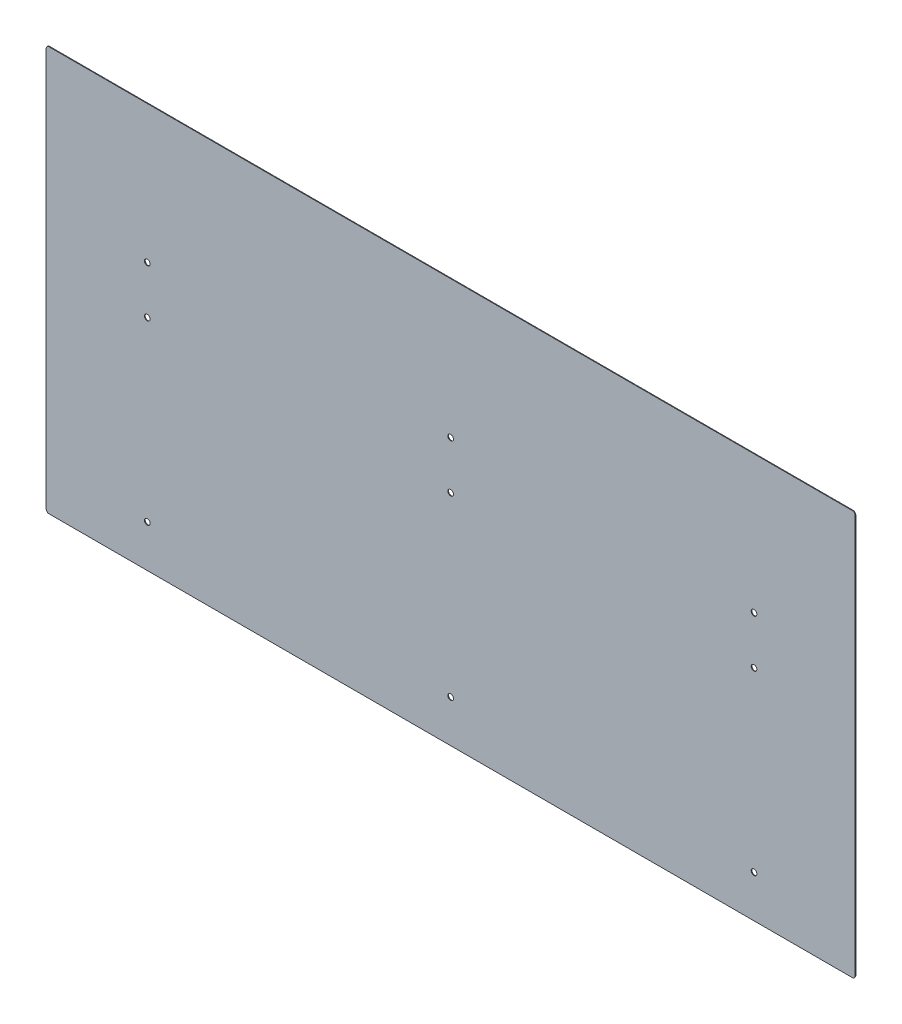
ISO-10303-21;
HEADER;
FILE_DESCRIPTION(('STEP AP214'),'2;1');
FILE_NAME('part.step','',(''),(''),'','','');
FILE_SCHEMA(('AUTOMOTIVE_DESIGN { 1 0 10303 214 1 1 1 1 }'));
ENDSEC;
DATA;
#1=APPLICATION_CONTEXT('core data for automotive mechanical design processes');
#2=APPLICATION_PROTOCOL_DEFINITION('international standard','automotive_design',2000,#1);
#3=PRODUCT_CONTEXT('',#1,'mechanical');
#4=PRODUCT('Part','Part','',(#3));
#5=PRODUCT_RELATED_PRODUCT_CATEGORY('part','',(#4));
#6=PRODUCT_DEFINITION_FORMATION('','',#4);
#7=PRODUCT_DEFINITION_CONTEXT('part definition',#1,'design');
#8=PRODUCT_DEFINITION('design','',#6,#7);
#9=PRODUCT_DEFINITION_SHAPE('','',#8);
#10=(LENGTH_UNIT() NAMED_UNIT(*) SI_UNIT(.MILLI.,.METRE.));
#11=(NAMED_UNIT(*) PLANE_ANGLE_UNIT() SI_UNIT($,.RADIAN.));
#12=(NAMED_UNIT(*) SI_UNIT($,.STERADIAN.) SOLID_ANGLE_UNIT());
#13=UNCERTAINTY_MEASURE_WITH_UNIT(LENGTH_MEASURE(1.E-05),#10,'distance_accuracy_value','');
#14=(GEOMETRIC_REPRESENTATION_CONTEXT(3) GLOBAL_UNCERTAINTY_ASSIGNED_CONTEXT((#13)) GLOBAL_UNIT_ASSIGNED_CONTEXT((#10,
#11,#12)) REPRESENTATION_CONTEXT('',''));
#15=CARTESIAN_POINT('',(0.,0.,0.));
#16=DIRECTION('',(0.,0.,1.));
#17=DIRECTION('',(1.,0.,0.));
#18=AXIS2_PLACEMENT_3D('',#15,#16,#17);
#19=CARTESIAN_POINT('',(0.,0.,3.175));
#20=DIRECTION('',(1.,0.,0.));
#21=DIRECTION('',(0.,0.,-1.));
#22=AXIS2_PLACEMENT_3D('',#19,#20,#21);
#23=PLANE('',#22);
#24=DIRECTION('',(0.,0.,-1.));
#25=VECTOR('',#24,1.);
#26=CARTESIAN_POINT('',(0.,3.175,3.175));
#27=LINE('',#26,#25);
#28=CARTESIAN_POINT('',(0.,3.175,0.));
#29=VERTEX_POINT('',#28);
#30=CARTESIAN_POINT('',(0.,3.17499999999998,0.761999999999945));
#31=VERTEX_POINT('',#30);
#32=EDGE_CURVE('E48',#29,#31,#27,.F.);
#33=ORIENTED_EDGE('',*,*,#32,.T.);
#34=DIRECTION('',(0.,1.,0.));
#35=VECTOR('',#34,1.);
#36=CARTESIAN_POINT('',(0.,457.2,0.762));
#37=LINE('',#36,#35);
#38=CARTESIAN_POINT('',(0.,454.025,0.762));
#39=VERTEX_POINT('',#38);
#40=EDGE_CURVE('E104',#31,#39,#37,.T.);
#41=ORIENTED_EDGE('',*,*,#40,.T.);
#42=DIRECTION('',(0.,0.,-1.));
#43=VECTOR('',#42,1.);
#44=CARTESIAN_POINT('',(0.,454.025,3.175));
#45=LINE('',#44,#43);
#46=CARTESIAN_POINT('',(0.,454.025,0.));
#47=VERTEX_POINT('',#46);
#48=EDGE_CURVE('E130',#39,#47,#45,.T.);
#49=ORIENTED_EDGE('',*,*,#48,.T.);
#50=DIRECTION('',(0.,-1.,0.));
#51=VECTOR('',#50,1.);
#52=CARTESIAN_POINT('',(0.,0.,0.));
#53=LINE('',#52,#51);
#54=EDGE_CURVE('E128',#47,#29,#53,.T.);
#55=ORIENTED_EDGE('',*,*,#54,.T.);
#56=EDGE_LOOP('',(#33,#41,#49,#55));
#57=FACE_BOUND('',#56,.T.);
#58=ADVANCED_FACE('F39',(#57),#23,.F.);
#59=CARTESIAN_POINT('',(0.,0.,3.175));
#60=DIRECTION('',(0.,1.,0.));
#61=DIRECTION('',(0.,0.,1.));
#62=AXIS2_PLACEMENT_3D('',#59,#60,#61);
#63=PLANE('',#62);
#64=DIRECTION('',(0.,0.,-1.));
#65=VECTOR('',#64,1.);
#66=CARTESIAN_POINT('',(911.225,0.,3.175));
#67=LINE('',#66,#65);
#68=CARTESIAN_POINT('',(911.225,0.,0.));
#69=VERTEX_POINT('',#68);
#70=CARTESIAN_POINT('',(911.225,0.,0.761999999999945));
#71=VERTEX_POINT('',#70);
#72=EDGE_CURVE('E134',#69,#71,#67,.F.);
#73=ORIENTED_EDGE('',*,*,#72,.T.);
#74=DIRECTION('',(1.,0.,0.));
#75=VECTOR('',#74,1.);
#76=CARTESIAN_POINT('',(0.,0.,0.761999999999945));
#77=LINE('',#76,#75);
#78=CARTESIAN_POINT('',(3.175,0.,0.761999999999945));
#79=VERTEX_POINT('',#78);
#80=EDGE_CURVE('E124',#79,#71,#77,.T.);
#81=ORIENTED_EDGE('',*,*,#80,.F.);
#82=DIRECTION('',(0.,0.,-1.));
#83=VECTOR('',#82,1.);
#84=CARTESIAN_POINT('',(3.175,0.,3.175));
#85=LINE('',#84,#83);
#86=CARTESIAN_POINT('',(3.175,0.,0.));
#87=VERTEX_POINT('',#86);
#88=EDGE_CURVE('E121',#79,#87,#85,.T.);
#89=ORIENTED_EDGE('',*,*,#88,.T.);
#90=DIRECTION('',(1.,0.,0.));
#91=VECTOR('',#90,1.);
#92=CARTESIAN_POINT('',(0.,0.,0.));
#93=LINE('',#92,#91);
#94=EDGE_CURVE('E174',#87,#69,#93,.T.);
#95=ORIENTED_EDGE('',*,*,#94,.T.);
#96=EDGE_LOOP('',(#73,#81,#89,#95));
#97=FACE_BOUND('',#96,.T.);
#98=ADVANCED_FACE('F282',(#97),#63,.F.);
#99=CARTESIAN_POINT('',(914.4,0.,3.175));
#100=DIRECTION('',(-1.,0.,0.));
#101=DIRECTION('',(0.,0.,1.));
#102=AXIS2_PLACEMENT_3D('',#99,#100,#101);
#103=PLANE('',#102);
#104=DIRECTION('',(0.,0.,-1.));
#105=VECTOR('',#104,1.);
#106=CARTESIAN_POINT('',(914.4,454.025,3.175));
#107=LINE('',#106,#105);
#108=CARTESIAN_POINT('',(914.4,454.025,0.));
#109=VERTEX_POINT('',#108);
#110=CARTESIAN_POINT('',(914.4,454.025,0.762));
#111=VERTEX_POINT('',#110);
#112=EDGE_CURVE('E142',#109,#111,#107,.F.);
#113=ORIENTED_EDGE('',*,*,#112,.T.);
#114=DIRECTION('',(0.,1.,0.));
#115=VECTOR('',#114,1.);
#116=CARTESIAN_POINT('',(914.4,457.2,0.762));
#117=LINE('',#116,#115);
#118=CARTESIAN_POINT('',(914.4,3.17499999999998,0.761999999999945));
#119=VERTEX_POINT('',#118);
#120=EDGE_CURVE('E114',#119,#111,#117,.T.);
#121=ORIENTED_EDGE('',*,*,#120,.F.);
#122=DIRECTION('',(0.,0.,-1.));
#123=VECTOR('',#122,1.);
#124=CARTESIAN_POINT('',(914.4,3.175,3.175));
#125=LINE('',#124,#123);
#126=CARTESIAN_POINT('',(914.4,3.175,0.));
#127=VERTEX_POINT('',#126);
#128=EDGE_CURVE('E146',#119,#127,#125,.T.);
#129=ORIENTED_EDGE('',*,*,#128,.T.);
#130=DIRECTION('',(0.,1.,0.));
#131=VECTOR('',#130,1.);
#132=CARTESIAN_POINT('',(914.4,0.,0.));
#133=LINE('',#132,#131);
#134=EDGE_CURVE('E170',#127,#109,#133,.T.);
#135=ORIENTED_EDGE('',*,*,#134,.T.);
#136=EDGE_LOOP('',(#113,#121,#129,#135));
#137=FACE_BOUND('',#136,.T.);
#138=ADVANCED_FACE('F272',(#137),#103,.F.);
#139=CARTESIAN_POINT('',(0.,457.2,3.175));
#140=DIRECTION('',(0.,-1.,0.));
#141=DIRECTION('',(0.,0.,-1.));
#142=AXIS2_PLACEMENT_3D('',#139,#140,#141);
#143=PLANE('',#142);
#144=DIRECTION('',(0.,0.,-1.));
#145=VECTOR('',#144,1.);
#146=CARTESIAN_POINT('',(3.175,457.2,3.175));
#147=LINE('',#146,#145);
#148=CARTESIAN_POINT('',(3.175,457.2,0.));
#149=VERTEX_POINT('',#148);
#150=CARTESIAN_POINT('',(3.175,457.2,0.762));
#151=VERTEX_POINT('',#150);
#152=EDGE_CURVE('E162',#149,#151,#147,.F.);
#153=ORIENTED_EDGE('',*,*,#152,.T.);
#154=DIRECTION('',(1.,0.,0.));
#155=VECTOR('',#154,1.);
#156=CARTESIAN_POINT('',(0.,457.2,0.762));
#157=LINE('',#156,#155);
#158=CARTESIAN_POINT('',(911.225,457.2,0.762));
#159=VERTEX_POINT('',#158);
#160=EDGE_CURVE('E54',#151,#159,#157,.T.);
#161=ORIENTED_EDGE('',*,*,#160,.T.);
#162=DIRECTION('',(0.,0.,-1.));
#163=VECTOR('',#162,1.);
#164=CARTESIAN_POINT('',(911.225,457.2,3.175));
#165=LINE('',#164,#163);
#166=CARTESIAN_POINT('',(911.225,457.2,0.));
#167=VERTEX_POINT('',#166);
#168=EDGE_CURVE('E159',#159,#167,#165,.T.);
#169=ORIENTED_EDGE('',*,*,#168,.T.);
#170=DIRECTION('',(-1.,0.,0.));
#171=VECTOR('',#170,1.);
#172=CARTESIAN_POINT('',(0.,457.2,0.));
#173=LINE('',#172,#171);
#174=EDGE_CURVE('E166',#167,#149,#173,.T.);
#175=ORIENTED_EDGE('',*,*,#174,.T.);
#176=EDGE_LOOP('',(#153,#161,#169,#175));
#177=FACE_BOUND('',#176,.T.);
#178=ADVANCED_FACE('F278',(#177),#143,.F.);
#179=CARTESIAN_POINT('',(0.,0.,0.));
#180=DIRECTION('',(0.,0.,-1.));
#181=DIRECTION('',(-1.,0.,0.));
#182=AXIS2_PLACEMENT_3D('',#179,#180,#181);
#183=PLANE('',#182);
#184=CARTESIAN_POINT('',(114.3,247.65,0.));
#185=DIRECTION('',(0.,0.,1.));
#186=DIRECTION('',(1.,0.,0.));
#187=AXIS2_PLACEMENT_3D('',#184,#185,#186);
#188=CIRCLE('',#187,3.175);
#189=CARTESIAN_POINT('',(117.475,247.65,0.));
#190=VERTEX_POINT('',#189);
#191=EDGE_CURVE('E211',#190,#190,#188,.T.);
#192=ORIENTED_EDGE('',*,*,#191,.T.);
#193=EDGE_LOOP('',(#192));
#194=FACE_BOUND('',#193,.T.);
#195=CARTESIAN_POINT('',(114.3,301.625,0.));
#196=DIRECTION('',(0.,0.,1.));
#197=DIRECTION('',(1.,0.,0.));
#198=AXIS2_PLACEMENT_3D('',#195,#196,#197);
#199=CIRCLE('',#198,3.175);
#200=CARTESIAN_POINT('',(117.475,301.625,0.));
#201=VERTEX_POINT('',#200);
#202=EDGE_CURVE('E207',#201,#201,#199,.T.);
#203=ORIENTED_EDGE('',*,*,#202,.T.);
#204=EDGE_LOOP('',(#203));
#205=FACE_BOUND('',#204,.T.);
#206=CARTESIAN_POINT('',(457.2,301.625,0.));
#207=DIRECTION('',(0.,0.,1.));
#208=DIRECTION('',(1.,0.,0.));
#209=AXIS2_PLACEMENT_3D('',#206,#207,#208);
#210=CIRCLE('',#209,3.17499999999998);
#211=CARTESIAN_POINT('',(460.375,301.625,0.));
#212=VERTEX_POINT('',#211);
#213=EDGE_CURVE('E203',#212,#212,#210,.T.);
#214=ORIENTED_EDGE('',*,*,#213,.T.);
#215=EDGE_LOOP('',(#214));
#216=FACE_BOUND('',#215,.T.);
#217=CARTESIAN_POINT('',(457.2,247.65,0.));
#218=DIRECTION('',(0.,0.,1.));
#219=DIRECTION('',(1.,0.,0.));
#220=AXIS2_PLACEMENT_3D('',#217,#218,#219);
#221=CIRCLE('',#220,3.17499999999998);
#222=CARTESIAN_POINT('',(460.375,247.65,0.));
#223=VERTEX_POINT('',#222);
#224=EDGE_CURVE('E199',#223,#223,#221,.T.);
#225=ORIENTED_EDGE('',*,*,#224,.T.);
#226=EDGE_LOOP('',(#225));
#227=FACE_BOUND('',#226,.T.);
#228=CARTESIAN_POINT('',(800.1,247.65,0.));
#229=DIRECTION('',(0.,0.,1.));
#230=DIRECTION('',(1.,0.,0.));
#231=AXIS2_PLACEMENT_3D('',#228,#229,#230);
#232=CIRCLE('',#231,3.17500000000004);
#233=CARTESIAN_POINT('',(803.275,247.65,0.));
#234=VERTEX_POINT('',#233);
#235=EDGE_CURVE('E195',#234,#234,#232,.T.);
#236=ORIENTED_EDGE('',*,*,#235,.T.);
#237=EDGE_LOOP('',(#236));
#238=FACE_BOUND('',#237,.T.);
#239=CARTESIAN_POINT('',(800.1,301.625,0.));
#240=DIRECTION('',(0.,0.,1.));
#241=DIRECTION('',(1.,0.,0.));
#242=AXIS2_PLACEMENT_3D('',#239,#240,#241);
#243=CIRCLE('',#242,3.17500000000004);
#244=CARTESIAN_POINT('',(803.275,301.625,0.));
#245=VERTEX_POINT('',#244);
#246=EDGE_CURVE('E191',#245,#245,#243,.T.);
#247=ORIENTED_EDGE('',*,*,#246,.T.);
#248=EDGE_LOOP('',(#247));
#249=FACE_BOUND('',#248,.T.);
#250=CARTESIAN_POINT('',(114.3,47.6249999999997,0.));
#251=DIRECTION('',(0.,0.,1.));
#252=DIRECTION('',(1.,0.,0.));
#253=AXIS2_PLACEMENT_3D('',#250,#251,#252);
#254=CIRCLE('',#253,3.175);
#255=CARTESIAN_POINT('',(117.475,47.6249999999997,0.));
#256=VERTEX_POINT('',#255);
#257=EDGE_CURVE('E187',#256,#256,#254,.T.);
#258=ORIENTED_EDGE('',*,*,#257,.T.);
#259=EDGE_LOOP('',(#258));
#260=FACE_BOUND('',#259,.T.);
#261=CARTESIAN_POINT('',(457.2,47.6249999999998,0.));
#262=DIRECTION('',(0.,0.,1.));
#263=DIRECTION('',(1.,0.,0.));
#264=AXIS2_PLACEMENT_3D('',#261,#262,#263);
#265=CIRCLE('',#264,3.17499999999998);
#266=CARTESIAN_POINT('',(460.375,47.6249999999998,0.));
#267=VERTEX_POINT('',#266);
#268=EDGE_CURVE('E183',#267,#267,#265,.T.);
#269=ORIENTED_EDGE('',*,*,#268,.T.);
#270=EDGE_LOOP('',(#269));
#271=FACE_BOUND('',#270,.T.);
#272=CARTESIAN_POINT('',(800.1,47.6249999999998,0.));
#273=DIRECTION('',(0.,0.,1.));
#274=DIRECTION('',(1.,0.,0.));
#275=AXIS2_PLACEMENT_3D('',#272,#273,#274);
#276=CIRCLE('',#275,3.17500000000004);
#277=CARTESIAN_POINT('',(803.275,47.6249999999998,0.));
#278=VERTEX_POINT('',#277);
#279=EDGE_CURVE('E179',#278,#278,#276,.T.);
#280=ORIENTED_EDGE('',*,*,#279,.T.);
#281=EDGE_LOOP('',(#280));
#282=FACE_BOUND('',#281,.T.);
#283=ORIENTED_EDGE('',*,*,#174,.F.);
#284=CARTESIAN_POINT('',(911.225,454.025,0.));
#285=DIRECTION('',(0.,0.,-1.));
#286=DIRECTION('',(-1.,0.,0.));
#287=AXIS2_PLACEMENT_3D('',#284,#285,#286);
#288=CIRCLE('',#287,3.175);
#289=EDGE_CURVE('E149',#167,#109,#288,.T.);
#290=ORIENTED_EDGE('',*,*,#289,.T.);
#291=ORIENTED_EDGE('',*,*,#134,.F.);
#292=CARTESIAN_POINT('',(911.225,3.175,0.));
#293=DIRECTION('',(0.,0.,-1.));
#294=DIRECTION('',(-1.,0.,0.));
#295=AXIS2_PLACEMENT_3D('',#292,#293,#294);
#296=CIRCLE('',#295,3.175);
#297=EDGE_CURVE('E62',#127,#69,#296,.T.);
#298=ORIENTED_EDGE('',*,*,#297,.T.);
#299=ORIENTED_EDGE('',*,*,#94,.F.);
#300=CARTESIAN_POINT('',(3.175,3.175,0.));
#301=DIRECTION('',(0.,0.,-1.));
#302=DIRECTION('',(-1.,0.,0.));
#303=AXIS2_PLACEMENT_3D('',#300,#301,#302);
#304=CIRCLE('',#303,3.175);
#305=EDGE_CURVE('E153',#87,#29,#304,.T.);
#306=ORIENTED_EDGE('',*,*,#305,.T.);
#307=ORIENTED_EDGE('',*,*,#54,.F.);
#308=CARTESIAN_POINT('',(3.175,454.025,0.));
#309=DIRECTION('',(0.,0.,-1.));
#310=DIRECTION('',(-1.,0.,0.));
#311=AXIS2_PLACEMENT_3D('',#308,#309,#310);
#312=CIRCLE('',#311,3.175);
#313=EDGE_CURVE('E156',#47,#149,#312,.T.);
#314=ORIENTED_EDGE('',*,*,#313,.T.);
#315=EDGE_LOOP('',(#283,#290,#291,#298,#299,#306,#307,#314));
#316=FACE_BOUND('',#315,.T.);
#317=ADVANCED_FACE('F274',(#194,#205,#216,#227,#238,#249,#260,#271,#282,#316),#183,.T.);
#318=CARTESIAN_POINT('',(800.1,47.6249999999998,3.175));
#319=DIRECTION('',(0.,0.,1.));
#320=DIRECTION('',(1.,0.,0.));
#321=AXIS2_PLACEMENT_3D('',#318,#319,#320);
#322=CYLINDRICAL_SURFACE('',#321,3.17500000000004);
#323=CARTESIAN_POINT('',(800.1,47.6249999999998,0.76199999999995));
#324=DIRECTION('',(0.,0.,-1.));
#325=DIRECTION('',(0.,1.,0.));
#326=AXIS2_PLACEMENT_3D('',#323,#324,#325);
#327=CIRCLE('',#326,3.17500000000004);
#328=CARTESIAN_POINT('',(800.1,50.7999999999998,0.76199999999995));
#329=VERTEX_POINT('',#328);
#330=EDGE_CURVE('E215',#329,#329,#327,.F.);
#331=ORIENTED_EDGE('',*,*,#330,.T.);
#332=EDGE_LOOP('',(#331));
#333=FACE_BOUND('',#332,.T.);
#334=ORIENTED_EDGE('',*,*,#279,.F.);
#335=EDGE_LOOP('',(#334));
#336=FACE_BOUND('',#335,.T.);
#337=ADVANCED_FACE('F306',(#333,#336),#322,.F.);
#338=CARTESIAN_POINT('',(457.2,47.6249999999998,3.175));
#339=DIRECTION('',(0.,0.,1.));
#340=DIRECTION('',(1.,0.,0.));
#341=AXIS2_PLACEMENT_3D('',#338,#339,#340);
#342=CYLINDRICAL_SURFACE('',#341,3.17499999999998);
#343=CARTESIAN_POINT('',(457.2,47.6249999999998,0.76199999999995));
#344=DIRECTION('',(0.,0.,-1.));
#345=DIRECTION('',(0.,1.,0.));
#346=AXIS2_PLACEMENT_3D('',#343,#344,#345);
#347=CIRCLE('',#346,3.17499999999998);
#348=CARTESIAN_POINT('',(457.2,50.7999999999998,0.76199999999995));
#349=VERTEX_POINT('',#348);
#350=EDGE_CURVE('E219',#349,#349,#347,.F.);
#351=ORIENTED_EDGE('',*,*,#350,.T.);
#352=EDGE_LOOP('',(#351));
#353=FACE_BOUND('',#352,.T.);
#354=ORIENTED_EDGE('',*,*,#268,.F.);
#355=EDGE_LOOP('',(#354));
#356=FACE_BOUND('',#355,.T.);
#357=ADVANCED_FACE('F310',(#353,#356),#342,.F.);
#358=CARTESIAN_POINT('',(114.3,47.6249999999997,3.175));
#359=DIRECTION('',(0.,0.,1.));
#360=DIRECTION('',(1.,0.,0.));
#361=AXIS2_PLACEMENT_3D('',#358,#359,#360);
#362=CYLINDRICAL_SURFACE('',#361,3.175);
#363=CARTESIAN_POINT('',(114.3,47.6249999999997,0.76199999999995));
#364=DIRECTION('',(0.,0.,-1.));
#365=DIRECTION('',(0.,1.,0.));
#366=AXIS2_PLACEMENT_3D('',#363,#364,#365);
#367=CIRCLE('',#366,3.175);
#368=CARTESIAN_POINT('',(114.3,50.7999999999997,0.76199999999995));
#369=VERTEX_POINT('',#368);
#370=EDGE_CURVE('E223',#369,#369,#367,.F.);
#371=ORIENTED_EDGE('',*,*,#370,.T.);
#372=EDGE_LOOP('',(#371));
#373=FACE_BOUND('',#372,.T.);
#374=ORIENTED_EDGE('',*,*,#257,.F.);
#375=EDGE_LOOP('',(#374));
#376=FACE_BOUND('',#375,.T.);
#377=ADVANCED_FACE('F314',(#373,#376),#362,.F.);
#378=CARTESIAN_POINT('',(800.1,301.625,3.175));
#379=DIRECTION('',(0.,0.,1.));
#380=DIRECTION('',(1.,0.,0.));
#381=AXIS2_PLACEMENT_3D('',#378,#379,#380);
#382=CYLINDRICAL_SURFACE('',#381,3.17500000000004);
#383=CARTESIAN_POINT('',(800.1,301.625,0.761999999999981));
#384=DIRECTION('',(0.,0.,-1.));
#385=DIRECTION('',(0.,1.,0.));
#386=AXIS2_PLACEMENT_3D('',#383,#384,#385);
#387=CIRCLE('',#386,3.17500000000004);
#388=CARTESIAN_POINT('',(800.1,304.8,0.761999999999981));
#389=VERTEX_POINT('',#388);
#390=EDGE_CURVE('E227',#389,#389,#387,.F.);
#391=ORIENTED_EDGE('',*,*,#390,.T.);
#392=EDGE_LOOP('',(#391));
#393=FACE_BOUND('',#392,.T.);
#394=ORIENTED_EDGE('',*,*,#246,.F.);
#395=EDGE_LOOP('',(#394));
#396=FACE_BOUND('',#395,.T.);
#397=ADVANCED_FACE('F318',(#393,#396),#382,.F.);
#398=CARTESIAN_POINT('',(800.1,247.65,3.175));
#399=DIRECTION('',(0.,0.,1.));
#400=DIRECTION('',(1.,0.,0.));
#401=AXIS2_PLACEMENT_3D('',#398,#399,#400);
#402=CYLINDRICAL_SURFACE('',#401,3.17500000000004);
#403=CARTESIAN_POINT('',(800.1,247.65,0.761999999999974));
#404=DIRECTION('',(0.,0.,-1.));
#405=DIRECTION('',(0.,1.,0.));
#406=AXIS2_PLACEMENT_3D('',#403,#404,#405);
#407=CIRCLE('',#406,3.17500000000004);
#408=CARTESIAN_POINT('',(800.1,250.825,0.761999999999974));
#409=VERTEX_POINT('',#408);
#410=EDGE_CURVE('E231',#409,#409,#407,.F.);
#411=ORIENTED_EDGE('',*,*,#410,.T.);
#412=EDGE_LOOP('',(#411));
#413=FACE_BOUND('',#412,.T.);
#414=ORIENTED_EDGE('',*,*,#235,.F.);
#415=EDGE_LOOP('',(#414));
#416=FACE_BOUND('',#415,.T.);
#417=ADVANCED_FACE('F322',(#413,#416),#402,.F.);
#418=CARTESIAN_POINT('',(457.2,247.65,3.175));
#419=DIRECTION('',(0.,0.,1.));
#420=DIRECTION('',(1.,0.,0.));
#421=AXIS2_PLACEMENT_3D('',#418,#419,#420);
#422=CYLINDRICAL_SURFACE('',#421,3.17499999999998);
#423=CARTESIAN_POINT('',(457.2,247.65,0.761999999999974));
#424=DIRECTION('',(0.,0.,-1.));
#425=DIRECTION('',(0.,1.,0.));
#426=AXIS2_PLACEMENT_3D('',#423,#424,#425);
#427=CIRCLE('',#426,3.17499999999998);
#428=CARTESIAN_POINT('',(457.2,250.825,0.761999999999974));
#429=VERTEX_POINT('',#428);
#430=EDGE_CURVE('E235',#429,#429,#427,.F.);
#431=ORIENTED_EDGE('',*,*,#430,.T.);
#432=EDGE_LOOP('',(#431));
#433=FACE_BOUND('',#432,.T.);
#434=ORIENTED_EDGE('',*,*,#224,.F.);
#435=EDGE_LOOP('',(#434));
#436=FACE_BOUND('',#435,.T.);
#437=ADVANCED_FACE('F326',(#433,#436),#422,.F.);
#438=CARTESIAN_POINT('',(457.2,301.625,3.175));
#439=DIRECTION('',(0.,0.,1.));
#440=DIRECTION('',(1.,0.,0.));
#441=AXIS2_PLACEMENT_3D('',#438,#439,#440);
#442=CYLINDRICAL_SURFACE('',#441,3.17499999999998);
#443=CARTESIAN_POINT('',(457.2,301.625,0.761999999999981));
#444=DIRECTION('',(0.,0.,-1.));
#445=DIRECTION('',(0.,1.,0.));
#446=AXIS2_PLACEMENT_3D('',#443,#444,#445);
#447=CIRCLE('',#446,3.17499999999998);
#448=CARTESIAN_POINT('',(457.2,304.8,0.761999999999981));
#449=VERTEX_POINT('',#448);
#450=EDGE_CURVE('E239',#449,#449,#447,.F.);
#451=ORIENTED_EDGE('',*,*,#450,.T.);
#452=EDGE_LOOP('',(#451));
#453=FACE_BOUND('',#452,.T.);
#454=ORIENTED_EDGE('',*,*,#213,.F.);
#455=EDGE_LOOP('',(#454));
#456=FACE_BOUND('',#455,.T.);
#457=ADVANCED_FACE('F330',(#453,#456),#442,.F.);
#458=CARTESIAN_POINT('',(114.3,301.625,3.175));
#459=DIRECTION('',(0.,0.,1.));
#460=DIRECTION('',(1.,0.,0.));
#461=AXIS2_PLACEMENT_3D('',#458,#459,#460);
#462=CYLINDRICAL_SURFACE('',#461,3.175);
#463=CARTESIAN_POINT('',(114.3,301.625,0.761999999999981));
#464=DIRECTION('',(0.,0.,-1.));
#465=DIRECTION('',(0.,1.,0.));
#466=AXIS2_PLACEMENT_3D('',#463,#464,#465);
#467=CIRCLE('',#466,3.175);
#468=CARTESIAN_POINT('',(114.3,304.8,0.761999999999981));
#469=VERTEX_POINT('',#468);
#470=EDGE_CURVE('E243',#469,#469,#467,.F.);
#471=ORIENTED_EDGE('',*,*,#470,.T.);
#472=EDGE_LOOP('',(#471));
#473=FACE_BOUND('',#472,.T.);
#474=ORIENTED_EDGE('',*,*,#202,.F.);
#475=EDGE_LOOP('',(#474));
#476=FACE_BOUND('',#475,.T.);
#477=ADVANCED_FACE('F334',(#473,#476),#462,.F.);
#478=CARTESIAN_POINT('',(114.3,247.65,3.175));
#479=DIRECTION('',(0.,0.,1.));
#480=DIRECTION('',(1.,0.,0.));
#481=AXIS2_PLACEMENT_3D('',#478,#479,#480);
#482=CYLINDRICAL_SURFACE('',#481,3.175);
#483=CARTESIAN_POINT('',(114.3,247.65,0.761999999999974));
#484=DIRECTION('',(0.,0.,-1.));
#485=DIRECTION('',(0.,1.,0.));
#486=AXIS2_PLACEMENT_3D('',#483,#484,#485);
#487=CIRCLE('',#486,3.175);
#488=CARTESIAN_POINT('',(114.3,250.825,0.761999999999974));
#489=VERTEX_POINT('',#488);
#490=EDGE_CURVE('E247',#489,#489,#487,.F.);
#491=ORIENTED_EDGE('',*,*,#490,.T.);
#492=EDGE_LOOP('',(#491));
#493=FACE_BOUND('',#492,.T.);
#494=ORIENTED_EDGE('',*,*,#191,.F.);
#495=EDGE_LOOP('',(#494));
#496=FACE_BOUND('',#495,.T.);
#497=ADVANCED_FACE('F291',(#493,#496),#482,.F.);
#498=CARTESIAN_POINT('',(911.225,454.025,3.175));
#499=DIRECTION('',(0.,0.,-1.));
#500=DIRECTION('',(-1.,0.,0.));
#501=AXIS2_PLACEMENT_3D('',#498,#499,#500);
#502=CYLINDRICAL_SURFACE('',#501,3.175);
#503=CARTESIAN_POINT('',(911.225,454.025,0.762));
#504=DIRECTION('',(0.,0.,-1.));
#505=DIRECTION('',(0.,1.,0.));
#506=AXIS2_PLACEMENT_3D('',#503,#504,#505);
#507=CIRCLE('',#506,3.175);
#508=EDGE_CURVE('E251',#111,#159,#507,.F.);
#509=ORIENTED_EDGE('',*,*,#508,.F.);
#510=ORIENTED_EDGE('',*,*,#112,.F.);
#511=ORIENTED_EDGE('',*,*,#289,.F.);
#512=ORIENTED_EDGE('',*,*,#168,.F.);
#513=EDGE_LOOP('',(#509,#510,#511,#512));
#514=FACE_BOUND('',#513,.T.);
#515=ADVANCED_FACE('F270',(#514),#502,.T.);
#516=CARTESIAN_POINT('',(911.225,3.175,3.175));
#517=DIRECTION('',(0.,0.,-1.));
#518=DIRECTION('',(-1.,0.,0.));
#519=AXIS2_PLACEMENT_3D('',#516,#517,#518);
#520=CYLINDRICAL_SURFACE('',#519,3.175);
#521=CARTESIAN_POINT('',(911.225,3.175,0.761999999999945));
#522=DIRECTION('',(0.,0.,-1.));
#523=DIRECTION('',(0.,1.,0.));
#524=AXIS2_PLACEMENT_3D('',#521,#522,#523);
#525=CIRCLE('',#524,3.175);
#526=EDGE_CURVE('E123',#71,#119,#525,.F.);
#527=ORIENTED_EDGE('',*,*,#526,.F.);
#528=ORIENTED_EDGE('',*,*,#72,.F.);
#529=ORIENTED_EDGE('',*,*,#297,.F.);
#530=ORIENTED_EDGE('',*,*,#128,.F.);
#531=EDGE_LOOP('',(#527,#528,#529,#530));
#532=FACE_BOUND('',#531,.T.);
#533=ADVANCED_FACE('F284',(#532),#520,.T.);
#534=CARTESIAN_POINT('',(3.175,3.175,3.175));
#535=DIRECTION('',(0.,0.,-1.));
#536=DIRECTION('',(-1.,0.,0.));
#537=AXIS2_PLACEMENT_3D('',#534,#535,#536);
#538=CYLINDRICAL_SURFACE('',#537,3.175);
#539=CARTESIAN_POINT('',(3.175,3.175,0.761999999999945));
#540=DIRECTION('',(0.,0.,-1.));
#541=DIRECTION('',(0.,1.,0.));
#542=AXIS2_PLACEMENT_3D('',#539,#540,#541);
#543=CIRCLE('',#542,3.175);
#544=EDGE_CURVE('E108',#31,#79,#543,.F.);
#545=ORIENTED_EDGE('',*,*,#544,.F.);
#546=ORIENTED_EDGE('',*,*,#32,.F.);
#547=ORIENTED_EDGE('',*,*,#305,.F.);
#548=ORIENTED_EDGE('',*,*,#88,.F.);
#549=EDGE_LOOP('',(#545,#546,#547,#548));
#550=FACE_BOUND('',#549,.T.);
#551=ADVANCED_FACE('F119',(#550),#538,.T.);
#552=CARTESIAN_POINT('',(3.175,454.025,3.175));
#553=DIRECTION('',(0.,0.,-1.));
#554=DIRECTION('',(-1.,0.,0.));
#555=AXIS2_PLACEMENT_3D('',#552,#553,#554);
#556=CYLINDRICAL_SURFACE('',#555,3.175);
#557=CARTESIAN_POINT('',(3.175,454.025,0.762));
#558=DIRECTION('',(0.,0.,-1.));
#559=DIRECTION('',(0.,1.,0.));
#560=AXIS2_PLACEMENT_3D('',#557,#558,#559);
#561=CIRCLE('',#560,3.175);
#562=EDGE_CURVE('E11',#151,#39,#561,.F.);
#563=ORIENTED_EDGE('',*,*,#562,.F.);
#564=ORIENTED_EDGE('',*,*,#152,.F.);
#565=ORIENTED_EDGE('',*,*,#313,.F.);
#566=ORIENTED_EDGE('',*,*,#48,.F.);
#567=EDGE_LOOP('',(#563,#564,#565,#566));
#568=FACE_BOUND('',#567,.T.);
#569=ADVANCED_FACE('F41',(#568),#556,.T.);
#570=CARTESIAN_POINT('',(0.,457.2,0.762));
#571=DIRECTION('',(0.,0.,-1.));
#572=DIRECTION('',(0.,1.,0.));
#573=AXIS2_PLACEMENT_3D('',#570,#571,#572);
#574=PLANE('',#573);
#575=ORIENTED_EDGE('',*,*,#350,.F.);
#576=EDGE_LOOP('',(#575));
#577=FACE_BOUND('',#576,.T.);
#578=ORIENTED_EDGE('',*,*,#390,.F.);
#579=EDGE_LOOP('',(#578));
#580=FACE_BOUND('',#579,.T.);
#581=ORIENTED_EDGE('',*,*,#430,.F.);
#582=EDGE_LOOP('',(#581));
#583=FACE_BOUND('',#582,.T.);
#584=ORIENTED_EDGE('',*,*,#470,.F.);
#585=EDGE_LOOP('',(#584));
#586=FACE_BOUND('',#585,.T.);
#587=ORIENTED_EDGE('',*,*,#508,.T.);
#588=ORIENTED_EDGE('',*,*,#160,.F.);
#589=ORIENTED_EDGE('',*,*,#562,.T.);
#590=ORIENTED_EDGE('',*,*,#40,.F.);
#591=ORIENTED_EDGE('',*,*,#544,.T.);
#592=ORIENTED_EDGE('',*,*,#80,.T.);
#593=ORIENTED_EDGE('',*,*,#526,.T.);
#594=ORIENTED_EDGE('',*,*,#120,.T.);
#595=EDGE_LOOP('',(#587,#588,#589,#590,#591,#592,#593,#594));
#596=FACE_BOUND('',#595,.T.);
#597=ORIENTED_EDGE('',*,*,#490,.F.);
#598=EDGE_LOOP('',(#597));
#599=FACE_BOUND('',#598,.T.);
#600=ORIENTED_EDGE('',*,*,#450,.F.);
#601=EDGE_LOOP('',(#600));
#602=FACE_BOUND('',#601,.T.);
#603=ORIENTED_EDGE('',*,*,#410,.F.);
#604=EDGE_LOOP('',(#603));
#605=FACE_BOUND('',#604,.T.);
#606=ORIENTED_EDGE('',*,*,#370,.F.);
#607=EDGE_LOOP('',(#606));
#608=FACE_BOUND('',#607,.T.);
#609=ORIENTED_EDGE('',*,*,#330,.F.);
#610=EDGE_LOOP('',(#609));
#611=FACE_BOUND('',#610,.T.);
#612=ADVANCED_FACE('F106',(#577,#580,#583,#586,#596,#599,#602,#605,#608,#611),#574,.F.);
#613=CLOSED_SHELL('',(#58,#98,#138,#178,#317,#337,#357,#377,#397,#417,#437,#457,#477,#497,#515,
#533,#551,#569,#612));
#614=MANIFOLD_SOLID_BREP('B2',#613);
#615=ADVANCED_BREP_SHAPE_REPRESENTATION('',(#18,#614),#14);
#616=SHAPE_DEFINITION_REPRESENTATION(#9,#615);
ENDSEC;
END-ISO-10303-21;
